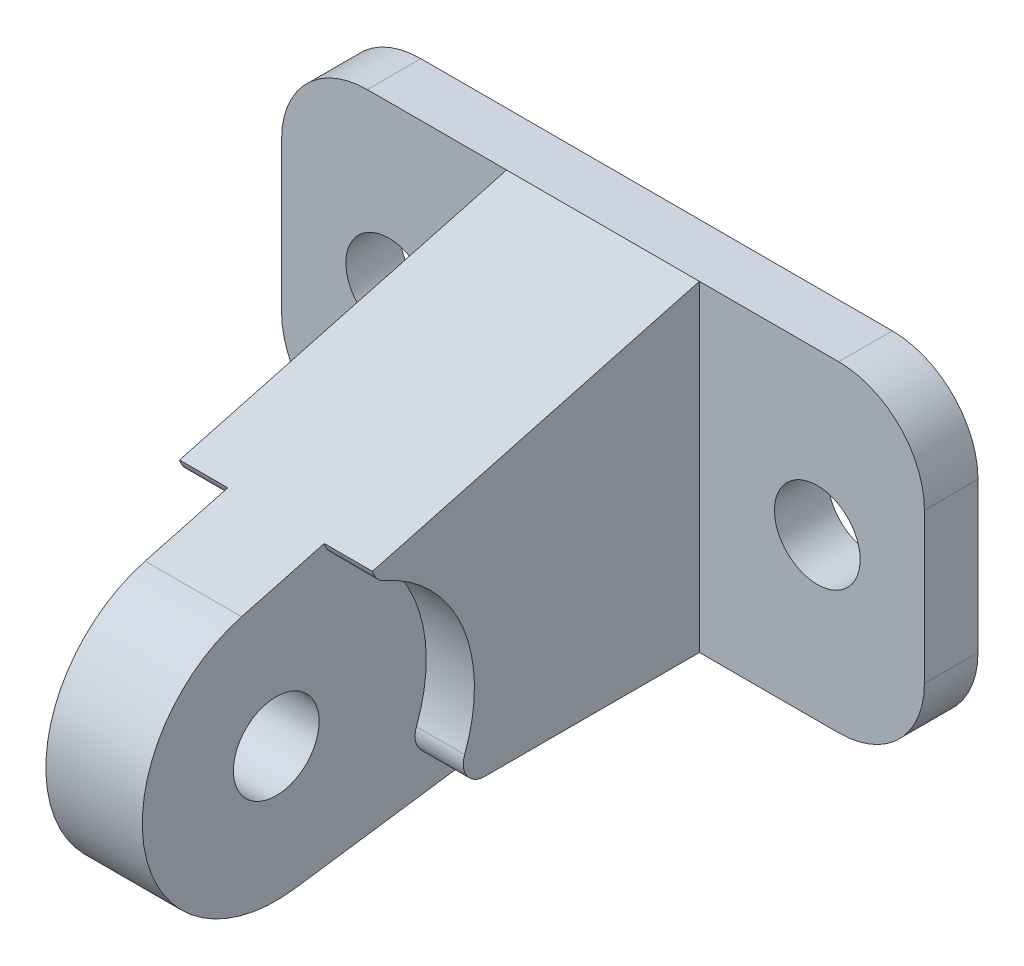
ISO-10303-21;
HEADER;
FILE_DESCRIPTION(('STEP AP214'),'2;1');
FILE_NAME('part.step','',(''),(''),'','','');
FILE_SCHEMA(('AUTOMOTIVE_DESIGN { 1 0 10303 214 1 1 1 1 }'));
ENDSEC;
DATA;
#1=APPLICATION_CONTEXT('core data for automotive mechanical design processes');
#2=APPLICATION_PROTOCOL_DEFINITION('international standard','automotive_design',2000,#1);
#3=PRODUCT_CONTEXT('',#1,'mechanical');
#4=PRODUCT('Part','Part','',(#3));
#5=PRODUCT_RELATED_PRODUCT_CATEGORY('part','',(#4));
#6=PRODUCT_DEFINITION_FORMATION('','',#4);
#7=PRODUCT_DEFINITION_CONTEXT('part definition',#1,'design');
#8=PRODUCT_DEFINITION('design','',#6,#7);
#9=PRODUCT_DEFINITION_SHAPE('','',#8);
#10=(LENGTH_UNIT() NAMED_UNIT(*) SI_UNIT(.MILLI.,.METRE.));
#11=(NAMED_UNIT(*) PLANE_ANGLE_UNIT() SI_UNIT($,.RADIAN.));
#12=(NAMED_UNIT(*) SI_UNIT($,.STERADIAN.) SOLID_ANGLE_UNIT());
#13=UNCERTAINTY_MEASURE_WITH_UNIT(LENGTH_MEASURE(1.E-05),#10,'distance_accuracy_value','');
#14=(GEOMETRIC_REPRESENTATION_CONTEXT(3) GLOBAL_UNCERTAINTY_ASSIGNED_CONTEXT((#13)) GLOBAL_UNIT_ASSIGNED_CONTEXT((#10,
#11,#12)) REPRESENTATION_CONTEXT('',''));
#15=CARTESIAN_POINT('',(0.,0.,0.));
#16=DIRECTION('',(0.,0.,1.));
#17=DIRECTION('',(1.,0.,0.));
#18=AXIS2_PLACEMENT_3D('',#15,#16,#17);
#19=CARTESIAN_POINT('',(22.,-7.,5.));
#20=DIRECTION('',(0.,0.,1.));
#21=DIRECTION('',(1.,0.,0.));
#22=AXIS2_PLACEMENT_3D('',#19,#20,#21);
#23=PLANE('',#22);
#24=CARTESIAN_POINT('',(-20.,0.,5.));
#25=DIRECTION('',(0.,0.,1.));
#26=DIRECTION('',(1.,0.,0.));
#27=AXIS2_PLACEMENT_3D('',#24,#25,#26);
#28=CIRCLE('',#27,4.);
#29=CARTESIAN_POINT('',(-16.,0.,5.));
#30=VERTEX_POINT('',#29);
#31=EDGE_CURVE('E337',#30,#30,#28,.T.);
#32=ORIENTED_EDGE('',*,*,#31,.F.);
#33=EDGE_LOOP('',(#32));
#34=FACE_BOUND('',#33,.T.);
#35=DIRECTION('',(1.,0.,0.));
#36=VECTOR('',#35,1.);
#37=CARTESIAN_POINT('',(-21.9999999999999,-15.,5.));
#38=LINE('',#37,#36);
#39=CARTESIAN_POINT('',(-21.9999999999999,-15.,5.));
#40=VERTEX_POINT('',#39);
#41=CARTESIAN_POINT('',(-9.,-15.,4.99999999999999));
#42=VERTEX_POINT('',#41);
#43=EDGE_CURVE('E369',#40,#42,#38,.T.);
#44=ORIENTED_EDGE('',*,*,#43,.T.);
#45=DIRECTION('',(0.,1.,0.));
#46=VECTOR('',#45,1.);
#47=CARTESIAN_POINT('',(-9.,0.,5.));
#48=LINE('',#47,#46);
#49=CARTESIAN_POINT('',(-9.,15.,5.));
#50=VERTEX_POINT('',#49);
#51=EDGE_CURVE('E236',#42,#50,#48,.T.);
#52=ORIENTED_EDGE('',*,*,#51,.T.);
#53=DIRECTION('',(-1.,0.,0.));
#54=VECTOR('',#53,1.);
#55=CARTESIAN_POINT('',(-21.9999999999999,15.,5.));
#56=LINE('',#55,#54);
#57=CARTESIAN_POINT('',(-21.9999999999999,15.,5.));
#58=VERTEX_POINT('',#57);
#59=EDGE_CURVE('E356',#50,#58,#56,.T.);
#60=ORIENTED_EDGE('',*,*,#59,.T.);
#61=CARTESIAN_POINT('',(-22.,7.,5.));
#62=DIRECTION('',(0.,0.,1.));
#63=DIRECTION('',(1.,0.,0.));
#64=AXIS2_PLACEMENT_3D('',#61,#62,#63);
#65=CIRCLE('',#64,8.);
#66=CARTESIAN_POINT('',(-30.,6.99999999999994,5.));
#67=VERTEX_POINT('',#66);
#68=EDGE_CURVE('E360',#58,#67,#65,.T.);
#69=ORIENTED_EDGE('',*,*,#68,.T.);
#70=DIRECTION('',(0.,-1.,0.));
#71=VECTOR('',#70,1.);
#72=CARTESIAN_POINT('',(-30.,6.99999999999994,5.));
#73=LINE('',#72,#71);
#74=CARTESIAN_POINT('',(-30.,-7.,5.));
#75=VERTEX_POINT('',#74);
#76=EDGE_CURVE('E363',#67,#75,#73,.T.);
#77=ORIENTED_EDGE('',*,*,#76,.T.);
#78=CARTESIAN_POINT('',(-22.,-7.,5.));
#79=DIRECTION('',(0.,0.,1.));
#80=DIRECTION('',(-1.,0.,0.));
#81=AXIS2_PLACEMENT_3D('',#78,#79,#80);
#82=CIRCLE('',#81,8.);
#83=EDGE_CURVE('E366',#75,#40,#82,.T.);
#84=ORIENTED_EDGE('',*,*,#83,.T.);
#85=EDGE_LOOP('',(#44,#52,#60,#69,#77,#84));
#86=FACE_BOUND('',#85,.T.);
#87=ADVANCED_FACE('F43',(#34,#86),#23,.T.);
#88=DIRECTION('',(0.,1.,0.));
#89=VECTOR('',#88,1.);
#90=CARTESIAN_POINT('',(9.,0.,5.));
#91=LINE('',#90,#89);
#92=CARTESIAN_POINT('',(9.,-15.,5.));
#93=VERTEX_POINT('',#92);
#94=CARTESIAN_POINT('',(9.,15.,5.));
#95=VERTEX_POINT('',#94);
#96=EDGE_CURVE('E66',#93,#95,#91,.T.);
#97=ORIENTED_EDGE('',*,*,#96,.F.);
#98=CARTESIAN_POINT('',(21.9999999999999,-15.,5.));
#99=VERTEX_POINT('',#98);
#100=EDGE_CURVE('E206',#93,#99,#38,.T.);
#101=ORIENTED_EDGE('',*,*,#100,.T.);
#102=CARTESIAN_POINT('',(22.,-7.,5.));
#103=DIRECTION('',(0.,0.,1.));
#104=DIRECTION('',(1.,0.,0.));
#105=AXIS2_PLACEMENT_3D('',#102,#103,#104);
#106=CIRCLE('',#105,8.);
#107=CARTESIAN_POINT('',(30.,-6.99999999999994,5.));
#108=VERTEX_POINT('',#107);
#109=EDGE_CURVE('E345',#99,#108,#106,.T.);
#110=ORIENTED_EDGE('',*,*,#109,.T.);
#111=DIRECTION('',(0.,1.,0.));
#112=VECTOR('',#111,1.);
#113=CARTESIAN_POINT('',(30.,6.99999999999994,5.));
#114=LINE('',#113,#112);
#115=CARTESIAN_POINT('',(30.,6.99999999999994,5.));
#116=VERTEX_POINT('',#115);
#117=EDGE_CURVE('E349',#108,#116,#114,.T.);
#118=ORIENTED_EDGE('',*,*,#117,.T.);
#119=CARTESIAN_POINT('',(22.,7.,5.));
#120=DIRECTION('',(0.,0.,1.));
#121=DIRECTION('',(1.,0.,0.));
#122=AXIS2_PLACEMENT_3D('',#119,#120,#121);
#123=CIRCLE('',#122,8.);
#124=CARTESIAN_POINT('',(21.9999999999999,15.,5.));
#125=VERTEX_POINT('',#124);
#126=EDGE_CURVE('E353',#116,#125,#123,.T.);
#127=ORIENTED_EDGE('',*,*,#126,.T.);
#128=EDGE_CURVE('E357',#125,#95,#56,.T.);
#129=ORIENTED_EDGE('',*,*,#128,.T.);
#130=EDGE_LOOP('',(#97,#101,#110,#118,#127,#129));
#131=FACE_BOUND('',#130,.T.);
#132=CARTESIAN_POINT('',(20.,0.,5.));
#133=DIRECTION('',(0.,0.,1.));
#134=DIRECTION('',(1.,0.,0.));
#135=AXIS2_PLACEMENT_3D('',#132,#133,#134);
#136=CIRCLE('',#135,4.);
#137=CARTESIAN_POINT('',(24.,0.,5.));
#138=VERTEX_POINT('',#137);
#139=EDGE_CURVE('E329',#138,#138,#136,.T.);
#140=ORIENTED_EDGE('',*,*,#139,.F.);
#141=EDGE_LOOP('',(#140));
#142=FACE_BOUND('',#141,.T.);
#143=ADVANCED_FACE('F461',(#131,#142),#23,.T.);
#144=CARTESIAN_POINT('',(22.,-7.,0.));
#145=DIRECTION('',(0.,0.,1.));
#146=DIRECTION('',(1.,0.,0.));
#147=AXIS2_PLACEMENT_3D('',#144,#145,#146);
#148=PLANE('',#147);
#149=CARTESIAN_POINT('',(22.,-7.,0.));
#150=DIRECTION('',(0.,0.,1.));
#151=DIRECTION('',(1.,0.,0.));
#152=AXIS2_PLACEMENT_3D('',#149,#150,#151);
#153=CIRCLE('',#152,8.);
#154=CARTESIAN_POINT('',(21.9999999999999,-15.,0.));
#155=VERTEX_POINT('',#154);
#156=CARTESIAN_POINT('',(30.,-6.99999999999994,0.));
#157=VERTEX_POINT('',#156);
#158=EDGE_CURVE('E341',#155,#157,#153,.T.);
#159=ORIENTED_EDGE('',*,*,#158,.F.);
#160=DIRECTION('',(1.,0.,0.));
#161=VECTOR('',#160,1.);
#162=CARTESIAN_POINT('',(-21.9999999999999,-15.,0.));
#163=LINE('',#162,#161);
#164=CARTESIAN_POINT('',(-21.9999999999999,-15.,0.));
#165=VERTEX_POINT('',#164);
#166=EDGE_CURVE('E350',#165,#155,#163,.T.);
#167=ORIENTED_EDGE('',*,*,#166,.F.);
#168=CARTESIAN_POINT('',(-22.,-7.,0.));
#169=DIRECTION('',(0.,0.,1.));
#170=DIRECTION('',(-1.,0.,0.));
#171=AXIS2_PLACEMENT_3D('',#168,#169,#170);
#172=CIRCLE('',#171,8.);
#173=CARTESIAN_POINT('',(-30.,-7.,0.));
#174=VERTEX_POINT('',#173);
#175=EDGE_CURVE('E392',#174,#165,#172,.T.);
#176=ORIENTED_EDGE('',*,*,#175,.F.);
#177=DIRECTION('',(0.,-1.,0.));
#178=VECTOR('',#177,1.);
#179=CARTESIAN_POINT('',(-30.,6.99999999999994,0.));
#180=LINE('',#179,#178);
#181=CARTESIAN_POINT('',(-30.,6.99999999999994,0.));
#182=VERTEX_POINT('',#181);
#183=EDGE_CURVE('E389',#182,#174,#180,.T.);
#184=ORIENTED_EDGE('',*,*,#183,.F.);
#185=CARTESIAN_POINT('',(-22.,7.,0.));
#186=DIRECTION('',(0.,0.,1.));
#187=DIRECTION('',(1.,0.,0.));
#188=AXIS2_PLACEMENT_3D('',#185,#186,#187);
#189=CIRCLE('',#188,8.);
#190=CARTESIAN_POINT('',(-21.9999999999999,15.,0.));
#191=VERTEX_POINT('',#190);
#192=EDGE_CURVE('E386',#191,#182,#189,.T.);
#193=ORIENTED_EDGE('',*,*,#192,.F.);
#194=DIRECTION('',(-1.,0.,0.));
#195=VECTOR('',#194,1.);
#196=CARTESIAN_POINT('',(-21.9999999999999,15.,0.));
#197=LINE('',#196,#195);
#198=CARTESIAN_POINT('',(21.9999999999999,15.,0.));
#199=VERTEX_POINT('',#198);
#200=EDGE_CURVE('E383',#199,#191,#197,.T.);
#201=ORIENTED_EDGE('',*,*,#200,.F.);
#202=CARTESIAN_POINT('',(22.,7.,0.));
#203=DIRECTION('',(0.,0.,1.));
#204=DIRECTION('',(1.,0.,0.));
#205=AXIS2_PLACEMENT_3D('',#202,#203,#204);
#206=CIRCLE('',#205,8.);
#207=CARTESIAN_POINT('',(30.,6.99999999999994,0.));
#208=VERTEX_POINT('',#207);
#209=EDGE_CURVE('E380',#208,#199,#206,.T.);
#210=ORIENTED_EDGE('',*,*,#209,.F.);
#211=DIRECTION('',(0.,1.,0.));
#212=VECTOR('',#211,1.);
#213=CARTESIAN_POINT('',(30.,6.99999999999994,0.));
#214=LINE('',#213,#212);
#215=EDGE_CURVE('E377',#157,#208,#214,.T.);
#216=ORIENTED_EDGE('',*,*,#215,.F.);
#217=EDGE_LOOP('',(#159,#167,#176,#184,#193,#201,#210,#216));
#218=FACE_BOUND('',#217,.T.);
#219=CARTESIAN_POINT('',(-20.,0.,0.));
#220=DIRECTION('',(0.,0.,1.));
#221=DIRECTION('',(1.,0.,0.));
#222=AXIS2_PLACEMENT_3D('',#219,#220,#221);
#223=CIRCLE('',#222,4.);
#224=CARTESIAN_POINT('',(-16.,0.,0.));
#225=VERTEX_POINT('',#224);
#226=EDGE_CURVE('E333',#225,#225,#223,.T.);
#227=ORIENTED_EDGE('',*,*,#226,.T.);
#228=EDGE_LOOP('',(#227));
#229=FACE_BOUND('',#228,.T.);
#230=CARTESIAN_POINT('',(20.,0.,0.));
#231=DIRECTION('',(0.,0.,1.));
#232=DIRECTION('',(1.,0.,0.));
#233=AXIS2_PLACEMENT_3D('',#230,#231,#232);
#234=CIRCLE('',#233,4.);
#235=CARTESIAN_POINT('',(24.,0.,0.));
#236=VERTEX_POINT('',#235);
#237=EDGE_CURVE('E328',#236,#236,#234,.T.);
#238=ORIENTED_EDGE('',*,*,#237,.T.);
#239=EDGE_LOOP('',(#238));
#240=FACE_BOUND('',#239,.T.);
#241=ADVANCED_FACE('F479',(#218,#229,#240),#148,.F.);
#242=CARTESIAN_POINT('',(22.,-7.,5.));
#243=DIRECTION('',(0.,0.,-1.));
#244=DIRECTION('',(-1.,0.,0.));
#245=AXIS2_PLACEMENT_3D('',#242,#243,#244);
#246=CYLINDRICAL_SURFACE('',#245,8.);
#247=ORIENTED_EDGE('',*,*,#158,.T.);
#248=DIRECTION('',(0.,0.,-1.));
#249=VECTOR('',#248,1.);
#250=CARTESIAN_POINT('',(30.,-6.99999999999994,5.));
#251=LINE('',#250,#249);
#252=EDGE_CURVE('E424',#108,#157,#251,.T.);
#253=ORIENTED_EDGE('',*,*,#252,.F.);
#254=ORIENTED_EDGE('',*,*,#109,.F.);
#255=DIRECTION('',(0.,0.,-1.));
#256=VECTOR('',#255,1.);
#257=CARTESIAN_POINT('',(21.9999999999999,-15.,5.));
#258=LINE('',#257,#256);
#259=EDGE_CURVE('E373',#99,#155,#258,.T.);
#260=ORIENTED_EDGE('',*,*,#259,.T.);
#261=EDGE_LOOP('',(#247,#253,#254,#260));
#262=FACE_BOUND('',#261,.T.);
#263=ADVANCED_FACE('F45',(#262),#246,.T.);
#264=CARTESIAN_POINT('',(30.,6.99999999999994,5.));
#265=DIRECTION('',(-1.,0.,0.));
#266=DIRECTION('',(0.,0.,1.));
#267=AXIS2_PLACEMENT_3D('',#264,#265,#266);
#268=PLANE('',#267);
#269=ORIENTED_EDGE('',*,*,#215,.T.);
#270=DIRECTION('',(0.,0.,-1.));
#271=VECTOR('',#270,1.);
#272=CARTESIAN_POINT('',(30.,6.99999999999994,5.));
#273=LINE('',#272,#271);
#274=EDGE_CURVE('E420',#116,#208,#273,.T.);
#275=ORIENTED_EDGE('',*,*,#274,.F.);
#276=ORIENTED_EDGE('',*,*,#117,.F.);
#277=ORIENTED_EDGE('',*,*,#252,.T.);
#278=EDGE_LOOP('',(#269,#275,#276,#277));
#279=FACE_BOUND('',#278,.T.);
#280=ADVANCED_FACE('F469',(#279),#268,.F.);
#281=CARTESIAN_POINT('',(22.,7.,5.));
#282=DIRECTION('',(0.,0.,-1.));
#283=DIRECTION('',(-1.,0.,0.));
#284=AXIS2_PLACEMENT_3D('',#281,#282,#283);
#285=CYLINDRICAL_SURFACE('',#284,8.);
#286=ORIENTED_EDGE('',*,*,#209,.T.);
#287=DIRECTION('',(0.,0.,-1.));
#288=VECTOR('',#287,1.);
#289=CARTESIAN_POINT('',(21.9999999999999,15.,5.));
#290=LINE('',#289,#288);
#291=EDGE_CURVE('E416',#125,#199,#290,.T.);
#292=ORIENTED_EDGE('',*,*,#291,.F.);
#293=ORIENTED_EDGE('',*,*,#126,.F.);
#294=ORIENTED_EDGE('',*,*,#274,.T.);
#295=EDGE_LOOP('',(#286,#292,#293,#294));
#296=FACE_BOUND('',#295,.T.);
#297=ADVANCED_FACE('F474',(#296),#285,.T.);
#298=CARTESIAN_POINT('',(-21.9999999999999,15.,5.));
#299=DIRECTION('',(0.,-1.,0.));
#300=DIRECTION('',(0.,0.,-1.));
#301=AXIS2_PLACEMENT_3D('',#298,#299,#300);
#302=PLANE('',#301);
#303=ORIENTED_EDGE('',*,*,#200,.T.);
#304=DIRECTION('',(0.,0.,-1.));
#305=VECTOR('',#304,1.);
#306=CARTESIAN_POINT('',(-21.9999999999999,15.,5.));
#307=LINE('',#306,#305);
#308=EDGE_CURVE('E412',#58,#191,#307,.T.);
#309=ORIENTED_EDGE('',*,*,#308,.F.);
#310=ORIENTED_EDGE('',*,*,#59,.F.);
#311=EDGE_CURVE('E59',#95,#50,#56,.T.);
#312=ORIENTED_EDGE('',*,*,#311,.F.);
#313=ORIENTED_EDGE('',*,*,#128,.F.);
#314=ORIENTED_EDGE('',*,*,#291,.T.);
#315=EDGE_LOOP('',(#303,#309,#310,#312,#313,#314));
#316=FACE_BOUND('',#315,.T.);
#317=ADVANCED_FACE('F456',(#316),#302,.F.);
#318=CARTESIAN_POINT('',(-22.,7.,5.));
#319=DIRECTION('',(0.,0.,-1.));
#320=DIRECTION('',(-1.,0.,0.));
#321=AXIS2_PLACEMENT_3D('',#318,#319,#320);
#322=CYLINDRICAL_SURFACE('',#321,8.);
#323=ORIENTED_EDGE('',*,*,#192,.T.);
#324=DIRECTION('',(0.,0.,-1.));
#325=VECTOR('',#324,1.);
#326=CARTESIAN_POINT('',(-30.,6.99999999999994,5.));
#327=LINE('',#326,#325);
#328=EDGE_CURVE('E408',#67,#182,#327,.T.);
#329=ORIENTED_EDGE('',*,*,#328,.F.);
#330=ORIENTED_EDGE('',*,*,#68,.F.);
#331=ORIENTED_EDGE('',*,*,#308,.T.);
#332=EDGE_LOOP('',(#323,#329,#330,#331));
#333=FACE_BOUND('',#332,.T.);
#334=ADVANCED_FACE('F485',(#333),#322,.T.);
#335=CARTESIAN_POINT('',(-30.,6.99999999999994,5.));
#336=DIRECTION('',(1.,0.,0.));
#337=DIRECTION('',(0.,0.,-1.));
#338=AXIS2_PLACEMENT_3D('',#335,#336,#337);
#339=PLANE('',#338);
#340=ORIENTED_EDGE('',*,*,#183,.T.);
#341=DIRECTION('',(0.,0.,-1.));
#342=VECTOR('',#341,1.);
#343=CARTESIAN_POINT('',(-30.,-7.,5.));
#344=LINE('',#343,#342);
#345=EDGE_CURVE('E404',#75,#174,#344,.T.);
#346=ORIENTED_EDGE('',*,*,#345,.F.);
#347=ORIENTED_EDGE('',*,*,#76,.F.);
#348=ORIENTED_EDGE('',*,*,#328,.T.);
#349=EDGE_LOOP('',(#340,#346,#347,#348));
#350=FACE_BOUND('',#349,.T.);
#351=ADVANCED_FACE('F488',(#350),#339,.F.);
#352=CARTESIAN_POINT('',(-22.,-7.,5.));
#353=DIRECTION('',(0.,0.,-1.));
#354=DIRECTION('',(-1.,0.,0.));
#355=AXIS2_PLACEMENT_3D('',#352,#353,#354);
#356=CYLINDRICAL_SURFACE('',#355,8.);
#357=ORIENTED_EDGE('',*,*,#175,.T.);
#358=DIRECTION('',(0.,0.,-1.));
#359=VECTOR('',#358,1.);
#360=CARTESIAN_POINT('',(-21.9999999999999,-15.,5.));
#361=LINE('',#360,#359);
#362=EDGE_CURVE('E400',#40,#165,#361,.T.);
#363=ORIENTED_EDGE('',*,*,#362,.F.);
#364=ORIENTED_EDGE('',*,*,#83,.F.);
#365=ORIENTED_EDGE('',*,*,#345,.T.);
#366=EDGE_LOOP('',(#357,#363,#364,#365));
#367=FACE_BOUND('',#366,.T.);
#368=ADVANCED_FACE('F493',(#367),#356,.T.);
#369=CARTESIAN_POINT('',(-21.9999999999999,-15.,5.));
#370=DIRECTION('',(0.,1.,0.));
#371=DIRECTION('',(0.,0.,1.));
#372=AXIS2_PLACEMENT_3D('',#369,#370,#371);
#373=PLANE('',#372);
#374=ORIENTED_EDGE('',*,*,#166,.T.);
#375=ORIENTED_EDGE('',*,*,#259,.F.);
#376=ORIENTED_EDGE('',*,*,#100,.F.);
#377=DIRECTION('',(0.,0.,-1.));
#378=VECTOR('',#377,1.);
#379=CARTESIAN_POINT('',(9.,-15.,0.));
#380=LINE('',#379,#378);
#381=CARTESIAN_POINT('',(9.,-15.,25.0424528800155));
#382=VERTEX_POINT('',#381);
#383=EDGE_CURVE('E203',#382,#93,#380,.T.);
#384=ORIENTED_EDGE('',*,*,#383,.F.);
#385=DIRECTION('',(1.,0.,0.));
#386=VECTOR('',#385,1.);
#387=CARTESIAN_POINT('',(-9.,-15.,25.0424528800155));
#388=LINE('',#387,#386);
#389=CARTESIAN_POINT('',(4.5,-15.,25.0424528800155));
#390=VERTEX_POINT('',#389);
#391=EDGE_CURVE('E189',#390,#382,#388,.T.);
#392=ORIENTED_EDGE('',*,*,#391,.F.);
#393=DIRECTION('',(0.,0.,-1.));
#394=VECTOR('',#393,1.);
#395=CARTESIAN_POINT('',(4.5,-15.,40.));
#396=LINE('',#395,#394);
#397=CARTESIAN_POINT('',(4.5,-15.,4.99999999999999));
#398=VERTEX_POINT('',#397);
#399=EDGE_CURVE('E271',#390,#398,#396,.T.);
#400=ORIENTED_EDGE('',*,*,#399,.T.);
#401=DIRECTION('',(-1.,0.,0.));
#402=VECTOR('',#401,1.);
#403=CARTESIAN_POINT('',(4.5,-15.,5.));
#404=LINE('',#403,#402);
#405=CARTESIAN_POINT('',(-4.5,-15.,5.));
#406=VERTEX_POINT('',#405);
#407=EDGE_CURVE('E308',#398,#406,#404,.T.);
#408=ORIENTED_EDGE('',*,*,#407,.T.);
#409=DIRECTION('',(0.,0.,-1.));
#410=VECTOR('',#409,1.);
#411=CARTESIAN_POINT('',(-4.5,-15.,40.));
#412=LINE('',#411,#410);
#413=CARTESIAN_POINT('',(-4.5,-15.,25.0424528800155));
#414=VERTEX_POINT('',#413);
#415=EDGE_CURVE('E255',#414,#406,#412,.T.);
#416=ORIENTED_EDGE('',*,*,#415,.F.);
#417=CARTESIAN_POINT('',(-9.,-15.,25.0424528800155));
#418=VERTEX_POINT('',#417);
#419=EDGE_CURVE('E199',#418,#414,#388,.T.);
#420=ORIENTED_EDGE('',*,*,#419,.F.);
#421=DIRECTION('',(0.,0.,-1.));
#422=VECTOR('',#421,1.);
#423=CARTESIAN_POINT('',(-9.,-15.,0.));
#424=LINE('',#423,#422);
#425=EDGE_CURVE('E232',#418,#42,#424,.T.);
#426=ORIENTED_EDGE('',*,*,#425,.T.);
#427=ORIENTED_EDGE('',*,*,#43,.F.);
#428=ORIENTED_EDGE('',*,*,#362,.T.);
#429=EDGE_LOOP('',(#374,#375,#376,#384,#392,#400,#408,#416,#420,#426,#427,#428));
#430=FACE_BOUND('',#429,.T.);
#431=ADVANCED_FACE('F204',(#430),#373,.F.);
#432=CARTESIAN_POINT('',(-20.,0.,5.));
#433=DIRECTION('',(0.,0.,-1.));
#434=DIRECTION('',(-1.,0.,0.));
#435=AXIS2_PLACEMENT_3D('',#432,#433,#434);
#436=CYLINDRICAL_SURFACE('',#435,4.);
#437=ORIENTED_EDGE('',*,*,#31,.T.);
#438=EDGE_LOOP('',(#437));
#439=FACE_BOUND('',#438,.T.);
#440=ORIENTED_EDGE('',*,*,#226,.F.);
#441=EDGE_LOOP('',(#440));
#442=FACE_BOUND('',#441,.T.);
#443=ADVANCED_FACE('F541',(#439,#442),#436,.F.);
#444=CARTESIAN_POINT('',(20.,0.,5.));
#445=DIRECTION('',(0.,0.,-1.));
#446=DIRECTION('',(-1.,0.,0.));
#447=AXIS2_PLACEMENT_3D('',#444,#445,#446);
#448=CYLINDRICAL_SURFACE('',#447,4.);
#449=ORIENTED_EDGE('',*,*,#139,.T.);
#450=EDGE_LOOP('',(#449));
#451=FACE_BOUND('',#450,.T.);
#452=ORIENTED_EDGE('',*,*,#237,.F.);
#453=EDGE_LOOP('',(#452));
#454=FACE_BOUND('',#453,.T.);
#455=ADVANCED_FACE('F516',(#451,#454),#448,.F.);
#456=CARTESIAN_POINT('',(4.5,-7.31917399021551,40.));
#457=DIRECTION('',(1.,0.,0.));
#458=DIRECTION('',(0.,0.,-1.));
#459=AXIS2_PLACEMENT_3D('',#456,#457,#458);
#460=PLANE('',#459);
#461=CARTESIAN_POINT('',(4.5,7.33985202680401,33.5880614294626));
#462=DIRECTION('',(1.,0.,0.));
#463=DIRECTION('',(0.,0.,-1.));
#464=AXIS2_PLACEMENT_3D('',#461,#462,#463);
#465=CIRCLE('',#464,2.);
#466=CARTESIAN_POINT('',(4.5,6.82221393659897,35.5199130820408));
#467=VERTEX_POINT('',#466);
#468=CARTESIAN_POINT('',(4.5,5.50747377467657,34.3895537507798));
#469=VERTEX_POINT('',#468);
#470=EDGE_CURVE('E278',#467,#469,#465,.T.);
#471=ORIENTED_EDGE('',*,*,#470,.F.);
#472=DIRECTION('',(0.,-0.258819045102525,0.965925826289067));
#473=VECTOR('',#472,1.);
#474=CARTESIAN_POINT('',(4.5,15.,5.));
#475=LINE('',#474,#473);
#476=CARTESIAN_POINT('',(4.5,4.75489883839783,43.2352380637816));
#477=VERTEX_POINT('',#476);
#478=EDGE_CURVE('E297',#467,#477,#475,.T.);
#479=ORIENTED_EDGE('',*,*,#478,.T.);
#480=CARTESIAN_POINT('',(4.5,-7.31917399021551,40.));
#481=DIRECTION('',(1.,0.,0.));
#482=DIRECTION('',(0.,0.,-1.));
#483=AXIS2_PLACEMENT_3D('',#480,#481,#482);
#484=CIRCLE('',#483,12.5);
#485=CARTESIAN_POINT('',(4.5,-19.696337656186,38.2519097317984));
#486=VERTEX_POINT('',#485);
#487=EDGE_CURVE('E300',#477,#486,#484,.T.);
#488=ORIENTED_EDGE('',*,*,#487,.T.);
#489=DIRECTION('',(0.,0.139847221456125,-0.990173093277636));
#490=VECTOR('',#489,1.);
#491=CARTESIAN_POINT('',(4.5,-19.696337656186,38.2519097317984));
#492=LINE('',#491,#490);
#493=EDGE_CURVE('E304',#486,#398,#492,.T.);
#494=ORIENTED_EDGE('',*,*,#493,.T.);
#495=ORIENTED_EDGE('',*,*,#399,.F.);
#496=CARTESIAN_POINT('',(4.5,-13.,25.0424528800155));
#497=DIRECTION('',(1.,0.,0.));
#498=DIRECTION('',(0.,0.,-1.));
#499=AXIS2_PLACEMENT_3D('',#496,#497,#498);
#500=CIRCLE('',#499,2.);
#501=CARTESIAN_POINT('',(4.5,-12.2898967487769,26.9121462700136));
#502=VERTEX_POINT('',#501);
#503=EDGE_CURVE('E195',#390,#502,#500,.F.);
#504=ORIENTED_EDGE('',*,*,#503,.T.);
#505=CARTESIAN_POINT('',(4.5,-7.31917399021551,40.));
#506=DIRECTION('',(1.,0.,0.));
#507=DIRECTION('',(0.,0.,-1.));
#508=AXIS2_PLACEMENT_3D('',#505,#506,#507);
#509=CIRCLE('',#508,14.);
#510=EDGE_CURVE('E282',#469,#502,#509,.F.);
#511=ORIENTED_EDGE('',*,*,#510,.F.);
#512=EDGE_LOOP('',(#471,#479,#488,#494,#495,#504,#511));
#513=FACE_BOUND('',#512,.T.);
#514=CARTESIAN_POINT('',(4.5,-7.31917399021551,40.));
#515=DIRECTION('',(1.,0.,0.));
#516=DIRECTION('',(0.,0.,-1.));
#517=AXIS2_PLACEMENT_3D('',#514,#515,#516);
#518=CIRCLE('',#517,4.);
#519=CARTESIAN_POINT('',(4.5,-7.31917399021551,36.));
#520=VERTEX_POINT('',#519);
#521=EDGE_CURVE('E289',#520,#520,#518,.T.);
#522=ORIENTED_EDGE('',*,*,#521,.F.);
#523=EDGE_LOOP('',(#522));
#524=FACE_BOUND('',#523,.T.);
#525=ADVANCED_FACE('F513',(#513,#524),#460,.T.);
#526=CARTESIAN_POINT('',(-4.5,-7.31917399021551,40.));
#527=DIRECTION('',(1.,0.,0.));
#528=DIRECTION('',(0.,0.,-1.));
#529=AXIS2_PLACEMENT_3D('',#526,#527,#528);
#530=PLANE('',#529);
#531=DIRECTION('',(0.,-0.258819045102525,0.965925826289067));
#532=VECTOR('',#531,1.);
#533=CARTESIAN_POINT('',(-4.5,15.,5.));
#534=LINE('',#533,#532);
#535=CARTESIAN_POINT('',(-4.5,6.82221393659897,35.5199130820408));
#536=VERTEX_POINT('',#535);
#537=CARTESIAN_POINT('',(-4.5,4.75489883839783,43.2352380637816));
#538=VERTEX_POINT('',#537);
#539=EDGE_CURVE('E293',#536,#538,#534,.T.);
#540=ORIENTED_EDGE('',*,*,#539,.F.);
#541=CARTESIAN_POINT('',(-4.5,7.33985202680401,33.5880614294626));
#542=DIRECTION('',(1.,0.,0.));
#543=DIRECTION('',(0.,0.,-1.));
#544=AXIS2_PLACEMENT_3D('',#541,#542,#543);
#545=CIRCLE('',#544,2.);
#546=CARTESIAN_POINT('',(-4.5,5.50747377467657,34.3895537507798));
#547=VERTEX_POINT('',#546);
#548=EDGE_CURVE('E274',#536,#547,#545,.T.);
#549=ORIENTED_EDGE('',*,*,#548,.T.);
#550=CARTESIAN_POINT('',(-4.5,-7.31917399021551,40.));
#551=DIRECTION('',(1.,0.,0.));
#552=DIRECTION('',(0.,0.,-1.));
#553=AXIS2_PLACEMENT_3D('',#550,#551,#552);
#554=CIRCLE('',#553,14.);
#555=CARTESIAN_POINT('',(-4.5,-12.2898967487769,26.9121462700136));
#556=VERTEX_POINT('',#555);
#557=EDGE_CURVE('E11',#547,#556,#554,.F.);
#558=ORIENTED_EDGE('',*,*,#557,.T.);
#559=CARTESIAN_POINT('',(-4.5,-13.,25.0424528800155));
#560=DIRECTION('',(1.,0.,0.));
#561=DIRECTION('',(0.,0.,-1.));
#562=AXIS2_PLACEMENT_3D('',#559,#560,#561);
#563=CIRCLE('',#562,2.);
#564=EDGE_CURVE('E52',#414,#556,#563,.F.);
#565=ORIENTED_EDGE('',*,*,#564,.F.);
#566=ORIENTED_EDGE('',*,*,#415,.T.);
#567=DIRECTION('',(0.,0.139847221456125,-0.990173093277636));
#568=VECTOR('',#567,1.);
#569=CARTESIAN_POINT('',(-4.5,-19.696337656186,38.2519097317984));
#570=LINE('',#569,#568);
#571=CARTESIAN_POINT('',(-4.5,-19.696337656186,38.2519097317984));
#572=VERTEX_POINT('',#571);
#573=EDGE_CURVE('E301',#572,#406,#570,.T.);
#574=ORIENTED_EDGE('',*,*,#573,.F.);
#575=CARTESIAN_POINT('',(-4.5,-7.31917399021551,40.));
#576=DIRECTION('',(1.,0.,0.));
#577=DIRECTION('',(0.,0.,-1.));
#578=AXIS2_PLACEMENT_3D('',#575,#576,#577);
#579=CIRCLE('',#578,12.5);
#580=EDGE_CURVE('E311',#538,#572,#579,.T.);
#581=ORIENTED_EDGE('',*,*,#580,.F.);
#582=EDGE_LOOP('',(#540,#549,#558,#565,#566,#574,#581));
#583=FACE_BOUND('',#582,.T.);
#584=CARTESIAN_POINT('',(-4.5,-7.31917399021551,40.));
#585=DIRECTION('',(1.,0.,0.));
#586=DIRECTION('',(0.,0.,-1.));
#587=AXIS2_PLACEMENT_3D('',#584,#585,#586);
#588=CIRCLE('',#587,4.);
#589=CARTESIAN_POINT('',(-4.5,-7.31917399021551,36.));
#590=VERTEX_POINT('',#589);
#591=EDGE_CURVE('E288',#590,#590,#588,.T.);
#592=ORIENTED_EDGE('',*,*,#591,.T.);
#593=EDGE_LOOP('',(#592));
#594=FACE_BOUND('',#593,.T.);
#595=ADVANCED_FACE('F438',(#583,#594),#530,.F.);
#596=CARTESIAN_POINT('',(4.5,15.,5.));
#597=DIRECTION('',(0.,-0.965925826289067,-0.258819045102525));
#598=DIRECTION('',(0.,0.258819045102525,-0.965925826289067));
#599=AXIS2_PLACEMENT_3D('',#596,#597,#598);
#600=PLANE('',#599);
#601=ORIENTED_EDGE('',*,*,#478,.F.);
#602=DIRECTION('',(1.,0.,0.));
#603=VECTOR('',#602,1.);
#604=CARTESIAN_POINT('',(-9.,6.82221393659897,35.5199130820408));
#605=LINE('',#604,#603);
#606=CARTESIAN_POINT('',(9.,6.82221393659897,35.5199130820408));
#607=VERTEX_POINT('',#606);
#608=EDGE_CURVE('E265',#467,#607,#605,.T.);
#609=ORIENTED_EDGE('',*,*,#608,.T.);
#610=DIRECTION('',(0.,-0.258819045102525,0.965925826289067));
#611=VECTOR('',#610,1.);
#612=CARTESIAN_POINT('',(9.,15.2451905283833,4.08493649053897));
#613=LINE('',#612,#611);
#614=EDGE_CURVE('E220',#95,#607,#613,.T.);
#615=ORIENTED_EDGE('',*,*,#614,.F.);
#616=ORIENTED_EDGE('',*,*,#311,.T.);
#617=DIRECTION('',(0.,-0.258819045102525,0.965925826289067));
#618=VECTOR('',#617,1.);
#619=CARTESIAN_POINT('',(-9.,15.2451905283833,4.08493649053897));
#620=LINE('',#619,#618);
#621=CARTESIAN_POINT('',(-9.,6.82221393659897,35.5199130820408));
#622=VERTEX_POINT('',#621);
#623=EDGE_CURVE('E240',#50,#622,#620,.T.);
#624=ORIENTED_EDGE('',*,*,#623,.T.);
#625=EDGE_CURVE('E262',#622,#536,#605,.T.);
#626=ORIENTED_EDGE('',*,*,#625,.T.);
#627=ORIENTED_EDGE('',*,*,#539,.T.);
#628=DIRECTION('',(-1.,0.,0.));
#629=VECTOR('',#628,1.);
#630=CARTESIAN_POINT('',(4.5,4.75489883839783,43.2352380637816));
#631=LINE('',#630,#629);
#632=EDGE_CURVE('E324',#477,#538,#631,.T.);
#633=ORIENTED_EDGE('',*,*,#632,.F.);
#634=EDGE_LOOP('',(#601,#609,#615,#616,#624,#626,#627,#633));
#635=FACE_BOUND('',#634,.T.);
#636=ADVANCED_FACE('F446',(#635),#600,.F.);
#637=CARTESIAN_POINT('',(4.5,-7.31917399021551,40.));
#638=DIRECTION('',(-1.,0.,0.));
#639=DIRECTION('',(0.,0.,1.));
#640=AXIS2_PLACEMENT_3D('',#637,#638,#639);
#641=CYLINDRICAL_SURFACE('',#640,12.5);
#642=ORIENTED_EDGE('',*,*,#580,.T.);
#643=DIRECTION('',(-1.,0.,0.));
#644=VECTOR('',#643,1.);
#645=CARTESIAN_POINT('',(4.5,-19.696337656186,38.2519097317984));
#646=LINE('',#645,#644);
#647=EDGE_CURVE('E320',#486,#572,#646,.T.);
#648=ORIENTED_EDGE('',*,*,#647,.F.);
#649=ORIENTED_EDGE('',*,*,#487,.F.);
#650=ORIENTED_EDGE('',*,*,#632,.T.);
#651=EDGE_LOOP('',(#642,#648,#649,#650));
#652=FACE_BOUND('',#651,.T.);
#653=ADVANCED_FACE('F501',(#652),#641,.T.);
#654=CARTESIAN_POINT('',(4.5,-19.696337656186,38.2519097317984));
#655=DIRECTION('',(0.,0.990173093277636,0.139847221456125));
#656=DIRECTION('',(0.,-0.139847221456125,0.990173093277636));
#657=AXIS2_PLACEMENT_3D('',#654,#655,#656);
#658=PLANE('',#657);
#659=ORIENTED_EDGE('',*,*,#573,.T.);
#660=ORIENTED_EDGE('',*,*,#407,.F.);
#661=ORIENTED_EDGE('',*,*,#493,.F.);
#662=ORIENTED_EDGE('',*,*,#647,.T.);
#663=EDGE_LOOP('',(#659,#660,#661,#662));
#664=FACE_BOUND('',#663,.T.);
#665=ADVANCED_FACE('F496',(#664),#658,.F.);
#666=CARTESIAN_POINT('',(4.5,-7.31917399021551,40.));
#667=DIRECTION('',(-1.,0.,0.));
#668=DIRECTION('',(0.,0.,1.));
#669=AXIS2_PLACEMENT_3D('',#666,#667,#668);
#670=CYLINDRICAL_SURFACE('',#669,4.);
#671=ORIENTED_EDGE('',*,*,#521,.T.);
#672=EDGE_LOOP('',(#671));
#673=FACE_BOUND('',#672,.T.);
#674=ORIENTED_EDGE('',*,*,#591,.F.);
#675=EDGE_LOOP('',(#674));
#676=FACE_BOUND('',#675,.T.);
#677=ADVANCED_FACE('F520',(#673,#676),#670,.F.);
#678=CARTESIAN_POINT('',(-9.,7.33985202680401,33.5880614294626));
#679=DIRECTION('',(1.,0.,0.));
#680=DIRECTION('',(0.,0.,-1.));
#681=AXIS2_PLACEMENT_3D('',#678,#679,#680);
#682=CYLINDRICAL_SURFACE('',#681,2.);
#683=ORIENTED_EDGE('',*,*,#548,.F.);
#684=ORIENTED_EDGE('',*,*,#625,.F.);
#685=CARTESIAN_POINT('',(-9.,7.33985202680401,33.5880614294626));
#686=DIRECTION('',(1.,0.,0.));
#687=DIRECTION('',(0.,0.,-1.));
#688=AXIS2_PLACEMENT_3D('',#685,#686,#687);
#689=CIRCLE('',#688,2.);
#690=CARTESIAN_POINT('',(-9.,5.50747377467657,34.3895537507798));
#691=VERTEX_POINT('',#690);
#692=EDGE_CURVE('E244',#622,#691,#689,.T.);
#693=ORIENTED_EDGE('',*,*,#692,.T.);
#694=DIRECTION('',(1.,0.,0.));
#695=VECTOR('',#694,1.);
#696=CARTESIAN_POINT('',(-9.,5.50747377467657,34.3895537507798));
#697=LINE('',#696,#695);
#698=EDGE_CURVE('E257',#691,#547,#697,.T.);
#699=ORIENTED_EDGE('',*,*,#698,.T.);
#700=EDGE_LOOP('',(#683,#684,#693,#699));
#701=FACE_BOUND('',#700,.T.);
#702=ADVANCED_FACE('F442',(#701),#682,.T.);
#703=CARTESIAN_POINT('',(-9.,-7.31917399021551,40.));
#704=DIRECTION('',(1.,0.,0.));
#705=DIRECTION('',(0.,0.,-1.));
#706=AXIS2_PLACEMENT_3D('',#703,#704,#705);
#707=CYLINDRICAL_SURFACE('',#706,14.);
#708=ORIENTED_EDGE('',*,*,#557,.F.);
#709=ORIENTED_EDGE('',*,*,#698,.F.);
#710=CARTESIAN_POINT('',(-9.,-7.31917399021551,40.));
#711=DIRECTION('',(1.,0.,0.));
#712=DIRECTION('',(0.,0.,-1.));
#713=AXIS2_PLACEMENT_3D('',#710,#711,#712);
#714=CIRCLE('',#713,14.);
#715=CARTESIAN_POINT('',(-9.,-12.2898967487769,26.9121462700136));
#716=VERTEX_POINT('',#715);
#717=EDGE_CURVE('E200',#691,#716,#714,.F.);
#718=ORIENTED_EDGE('',*,*,#717,.T.);
#719=DIRECTION('',(1.,0.,0.));
#720=VECTOR('',#719,1.);
#721=CARTESIAN_POINT('',(-9.,-12.2898967487769,26.9121462700136));
#722=LINE('',#721,#720);
#723=EDGE_CURVE('E251',#716,#556,#722,.T.);
#724=ORIENTED_EDGE('',*,*,#723,.T.);
#725=EDGE_LOOP('',(#708,#709,#718,#724));
#726=FACE_BOUND('',#725,.T.);
#727=ADVANCED_FACE('F435',(#726),#707,.F.);
#728=CARTESIAN_POINT('',(-9.,-13.,25.0424528800155));
#729=DIRECTION('',(1.,0.,0.));
#730=DIRECTION('',(0.,0.,-1.));
#731=AXIS2_PLACEMENT_3D('',#728,#729,#730);
#732=CYLINDRICAL_SURFACE('',#731,2.);
#733=ORIENTED_EDGE('',*,*,#419,.T.);
#734=ORIENTED_EDGE('',*,*,#564,.T.);
#735=ORIENTED_EDGE('',*,*,#723,.F.);
#736=CARTESIAN_POINT('',(-9.,-13.,25.0424528800155));
#737=DIRECTION('',(1.,0.,0.));
#738=DIRECTION('',(0.,0.,-1.));
#739=AXIS2_PLACEMENT_3D('',#736,#737,#738);
#740=CIRCLE('',#739,2.);
#741=EDGE_CURVE('E229',#418,#716,#740,.F.);
#742=ORIENTED_EDGE('',*,*,#741,.F.);
#743=EDGE_LOOP('',(#733,#734,#735,#742));
#744=FACE_BOUND('',#743,.T.);
#745=ADVANCED_FACE('F431',(#744),#732,.T.);
#746=CARTESIAN_POINT('',(-9.,0.,0.));
#747=DIRECTION('',(1.,0.,0.));
#748=DIRECTION('',(0.,0.,-1.));
#749=AXIS2_PLACEMENT_3D('',#746,#747,#748);
#750=PLANE('',#749);
#751=ORIENTED_EDGE('',*,*,#741,.T.);
#752=ORIENTED_EDGE('',*,*,#717,.F.);
#753=ORIENTED_EDGE('',*,*,#692,.F.);
#754=ORIENTED_EDGE('',*,*,#623,.F.);
#755=ORIENTED_EDGE('',*,*,#51,.F.);
#756=ORIENTED_EDGE('',*,*,#425,.F.);
#757=EDGE_LOOP('',(#751,#752,#753,#754,#755,#756));
#758=FACE_BOUND('',#757,.T.);
#759=ADVANCED_FACE('F451',(#758),#750,.F.);
#760=ORIENTED_EDGE('',*,*,#503,.F.);
#761=ORIENTED_EDGE('',*,*,#391,.T.);
#762=CARTESIAN_POINT('',(9.,-13.,25.0424528800155));
#763=DIRECTION('',(1.,0.,0.));
#764=DIRECTION('',(0.,0.,-1.));
#765=AXIS2_PLACEMENT_3D('',#762,#763,#764);
#766=CIRCLE('',#765,2.);
#767=CARTESIAN_POINT('',(9.,-12.2898967487769,26.9121462700136));
#768=VERTEX_POINT('',#767);
#769=EDGE_CURVE('E194',#382,#768,#766,.F.);
#770=ORIENTED_EDGE('',*,*,#769,.T.);
#771=EDGE_CURVE('E256',#502,#768,#722,.T.);
#772=ORIENTED_EDGE('',*,*,#771,.F.);
#773=EDGE_LOOP('',(#760,#761,#770,#772));
#774=FACE_BOUND('',#773,.T.);
#775=ADVANCED_FACE('F191',(#774),#732,.T.);
#776=CARTESIAN_POINT('',(9.,5.50747377467657,34.3895537507798));
#777=VERTEX_POINT('',#776);
#778=EDGE_CURVE('E261',#469,#777,#697,.T.);
#779=ORIENTED_EDGE('',*,*,#778,.F.);
#780=ORIENTED_EDGE('',*,*,#510,.T.);
#781=ORIENTED_EDGE('',*,*,#771,.T.);
#782=CARTESIAN_POINT('',(9.,-7.31917399021551,40.));
#783=DIRECTION('',(1.,0.,0.));
#784=DIRECTION('',(0.,0.,-1.));
#785=AXIS2_PLACEMENT_3D('',#782,#783,#784);
#786=CIRCLE('',#785,14.);
#787=EDGE_CURVE('E214',#777,#768,#786,.F.);
#788=ORIENTED_EDGE('',*,*,#787,.F.);
#789=EDGE_LOOP('',(#779,#780,#781,#788));
#790=FACE_BOUND('',#789,.T.);
#791=ADVANCED_FACE('F512',(#790),#707,.F.);
#792=ORIENTED_EDGE('',*,*,#608,.F.);
#793=ORIENTED_EDGE('',*,*,#470,.T.);
#794=ORIENTED_EDGE('',*,*,#778,.T.);
#795=CARTESIAN_POINT('',(9.,7.33985202680401,33.5880614294626));
#796=DIRECTION('',(1.,0.,0.));
#797=DIRECTION('',(0.,0.,-1.));
#798=AXIS2_PLACEMENT_3D('',#795,#796,#797);
#799=CIRCLE('',#798,2.);
#800=EDGE_CURVE('E224',#607,#777,#799,.T.);
#801=ORIENTED_EDGE('',*,*,#800,.F.);
#802=EDGE_LOOP('',(#792,#793,#794,#801));
#803=FACE_BOUND('',#802,.T.);
#804=ADVANCED_FACE('F506',(#803),#682,.T.);
#805=CARTESIAN_POINT('',(9.,0.,0.));
#806=DIRECTION('',(1.,0.,0.));
#807=DIRECTION('',(0.,0.,-1.));
#808=AXIS2_PLACEMENT_3D('',#805,#806,#807);
#809=PLANE('',#808);
#810=ORIENTED_EDGE('',*,*,#769,.F.);
#811=ORIENTED_EDGE('',*,*,#383,.T.);
#812=ORIENTED_EDGE('',*,*,#96,.T.);
#813=ORIENTED_EDGE('',*,*,#614,.T.);
#814=ORIENTED_EDGE('',*,*,#800,.T.);
#815=ORIENTED_EDGE('',*,*,#787,.T.);
#816=EDGE_LOOP('',(#810,#811,#812,#813,#814,#815));
#817=FACE_BOUND('',#816,.T.);
#818=ADVANCED_FACE('F211',(#817),#809,.T.);
#819=CLOSED_SHELL('',(#87,#143,#241,#263,#280,#297,#317,#334,#351,#368,#431,#443,#455,#525,#595,
#636,#653,#665,#677,#702,#727,#745,#759,#775,#791,#804,#818));
#820=MANIFOLD_SOLID_BREP('B2',#819);
#821=ADVANCED_BREP_SHAPE_REPRESENTATION('',(#18,#820),#14);
#822=SHAPE_DEFINITION_REPRESENTATION(#9,#821);
ENDSEC;
END-ISO-10303-21;
